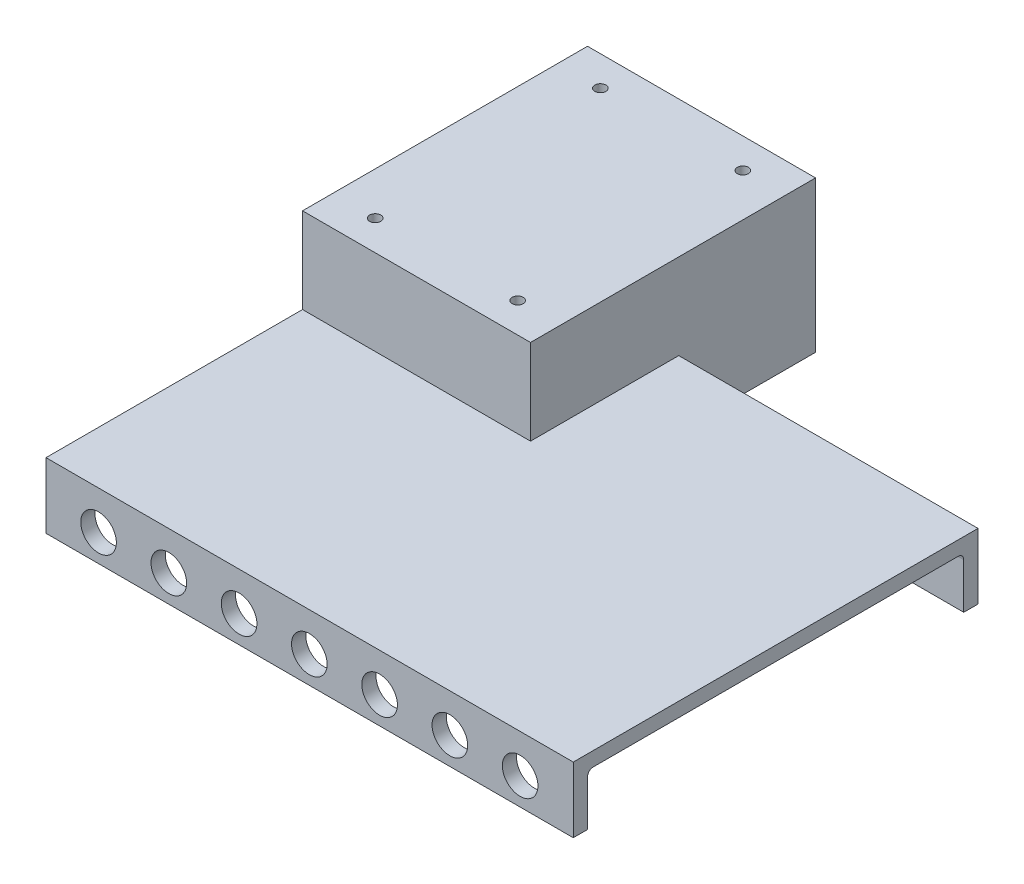
ISO-10303-21;
HEADER;
FILE_DESCRIPTION(('STEP AP214'),'2;1');
FILE_NAME('part.step','',(''),(''),'','','');
FILE_SCHEMA(('AUTOMOTIVE_DESIGN { 1 0 10303 214 1 1 1 1 }'));
ENDSEC;
DATA;
#1=APPLICATION_CONTEXT('core data for automotive mechanical design processes');
#2=APPLICATION_PROTOCOL_DEFINITION('international standard','automotive_design',2000,#1);
#3=PRODUCT_CONTEXT('',#1,'mechanical');
#4=PRODUCT('Part','Part','',(#3));
#5=PRODUCT_RELATED_PRODUCT_CATEGORY('part','',(#4));
#6=PRODUCT_DEFINITION_FORMATION('','',#4);
#7=PRODUCT_DEFINITION_CONTEXT('part definition',#1,'design');
#8=PRODUCT_DEFINITION('design','',#6,#7);
#9=PRODUCT_DEFINITION_SHAPE('','',#8);
#10=(LENGTH_UNIT() NAMED_UNIT(*) SI_UNIT(.MILLI.,.METRE.));
#11=(NAMED_UNIT(*) PLANE_ANGLE_UNIT() SI_UNIT($,.RADIAN.));
#12=(NAMED_UNIT(*) SI_UNIT($,.STERADIAN.) SOLID_ANGLE_UNIT());
#13=UNCERTAINTY_MEASURE_WITH_UNIT(LENGTH_MEASURE(1.E-05),#10,'distance_accuracy_value','');
#14=(GEOMETRIC_REPRESENTATION_CONTEXT(3) GLOBAL_UNCERTAINTY_ASSIGNED_CONTEXT((#13)) GLOBAL_UNIT_ASSIGNED_CONTEXT((#10,
#11,#12)) REPRESENTATION_CONTEXT('',''));
#15=CARTESIAN_POINT('',(0.,0.,0.));
#16=DIRECTION('',(0.,0.,1.));
#17=DIRECTION('',(1.,0.,0.));
#18=AXIS2_PLACEMENT_3D('',#15,#16,#17);
#19=CARTESIAN_POINT('',(0.,23.,0.));
#20=DIRECTION('',(1.,0.,0.));
#21=DIRECTION('',(0.,0.,-1.));
#22=AXIS2_PLACEMENT_3D('',#19,#20,#21);
#23=PLANE('',#22);
#24=DIRECTION('',(0.,-1.,0.));
#25=VECTOR('',#24,1.);
#26=CARTESIAN_POINT('',(0.,23.,-185.));
#27=LINE('',#26,#25);
#28=CARTESIAN_POINT('',(0.,46.,-185.));
#29=VERTEX_POINT('',#28);
#30=CARTESIAN_POINT('',(0.,0.,-185.));
#31=VERTEX_POINT('',#30);
#32=EDGE_CURVE('E217',#29,#31,#27,.T.);
#33=ORIENTED_EDGE('',*,*,#32,.F.);
#34=CARTESIAN_POINT('',(0.,46.,-183.));
#35=DIRECTION('',(1.,0.,0.));
#36=DIRECTION('',(0.,0.,-1.));
#37=AXIS2_PLACEMENT_3D('',#34,#35,#36);
#38=CIRCLE('',#37,2.);
#39=CARTESIAN_POINT('',(0.,48.,-183.));
#40=VERTEX_POINT('',#39);
#41=EDGE_CURVE('E348',#29,#40,#38,.T.);
#42=ORIENTED_EDGE('',*,*,#41,.T.);
#43=DIRECTION('',(0.,0.,1.));
#44=VECTOR('',#43,1.);
#45=CARTESIAN_POINT('',(0.,48.,0.));
#46=LINE('',#45,#44);
#47=CARTESIAN_POINT('',(0.,48.,-97.));
#48=VERTEX_POINT('',#47);
#49=EDGE_CURVE('E229',#40,#48,#46,.T.);
#50=ORIENTED_EDGE('',*,*,#49,.T.);
#51=CARTESIAN_POINT('',(0.,46.,-97.));
#52=DIRECTION('',(1.,0.,0.));
#53=DIRECTION('',(0.,0.,-1.));
#54=AXIS2_PLACEMENT_3D('',#51,#52,#53);
#55=CIRCLE('',#54,2.);
#56=CARTESIAN_POINT('',(0.,46.,-95.));
#57=VERTEX_POINT('',#56);
#58=EDGE_CURVE('E346',#48,#57,#55,.T.);
#59=ORIENTED_EDGE('',*,*,#58,.T.);
#60=DIRECTION('',(0.,-1.,0.));
#61=VECTOR('',#60,1.);
#62=CARTESIAN_POINT('',(0.,53.,-95.));
#63=LINE('',#62,#61);
#64=CARTESIAN_POINT('',(0.,18.,-95.));
#65=VERTEX_POINT('',#64);
#66=EDGE_CURVE('E196',#57,#65,#63,.T.);
#67=ORIENTED_EDGE('',*,*,#66,.T.);
#68=DIRECTION('',(0.,0.,1.));
#69=VECTOR('',#68,1.);
#70=CARTESIAN_POINT('',(0.,18.,0.));
#71=LINE('',#70,#69);
#72=CARTESIAN_POINT('',(0.,18.,-7.));
#73=VERTEX_POINT('',#72);
#74=EDGE_CURVE('E207',#65,#73,#71,.T.);
#75=ORIENTED_EDGE('',*,*,#74,.T.);
#76=CARTESIAN_POINT('',(0.,16.,-7.));
#77=DIRECTION('',(1.,0.,0.));
#78=DIRECTION('',(0.,0.,-1.));
#79=AXIS2_PLACEMENT_3D('',#76,#77,#78);
#80=CIRCLE('',#79,2.);
#81=CARTESIAN_POINT('',(0.,16.,-5.));
#82=VERTEX_POINT('',#81);
#83=EDGE_CURVE('E352',#73,#82,#80,.T.);
#84=ORIENTED_EDGE('',*,*,#83,.T.);
#85=DIRECTION('',(0.,-1.,0.));
#86=VECTOR('',#85,1.);
#87=CARTESIAN_POINT('',(0.,23.,-5.));
#88=LINE('',#87,#86);
#89=CARTESIAN_POINT('',(0.,0.,-5.));
#90=VERTEX_POINT('',#89);
#91=EDGE_CURVE('E223',#82,#90,#88,.T.);
#92=ORIENTED_EDGE('',*,*,#91,.T.);
#93=DIRECTION('',(0.,0.,1.));
#94=VECTOR('',#93,1.);
#95=CARTESIAN_POINT('',(0.,0.,0.));
#96=LINE('',#95,#94);
#97=CARTESIAN_POINT('',(0.,0.,0.));
#98=VERTEX_POINT('',#97);
#99=EDGE_CURVE('E276',#90,#98,#96,.T.);
#100=ORIENTED_EDGE('',*,*,#99,.T.);
#101=DIRECTION('',(0.,-1.,0.));
#102=VECTOR('',#101,1.);
#103=CARTESIAN_POINT('',(0.,23.,0.));
#104=LINE('',#103,#102);
#105=CARTESIAN_POINT('',(0.,23.,0.));
#106=VERTEX_POINT('',#105);
#107=EDGE_CURVE('E302',#106,#98,#104,.T.);
#108=ORIENTED_EDGE('',*,*,#107,.F.);
#109=DIRECTION('',(0.,0.,1.));
#110=VECTOR('',#109,1.);
#111=CARTESIAN_POINT('',(0.,23.,0.));
#112=LINE('',#111,#110);
#113=CARTESIAN_POINT('',(0.,23.,-90.));
#114=VERTEX_POINT('',#113);
#115=EDGE_CURVE('E277',#114,#106,#112,.T.);
#116=ORIENTED_EDGE('',*,*,#115,.F.);
#117=DIRECTION('',(0.,-1.,0.));
#118=VECTOR('',#117,1.);
#119=CARTESIAN_POINT('',(0.,53.,-90.));
#120=LINE('',#119,#118);
#121=CARTESIAN_POINT('',(0.,53.,-90.));
#122=VERTEX_POINT('',#121);
#123=EDGE_CURVE('E264',#122,#114,#120,.T.);
#124=ORIENTED_EDGE('',*,*,#123,.F.);
#125=DIRECTION('',(0.,0.,1.));
#126=VECTOR('',#125,1.);
#127=CARTESIAN_POINT('',(0.,53.,-90.));
#128=LINE('',#127,#126);
#129=CARTESIAN_POINT('',(0.,53.,-190.));
#130=VERTEX_POINT('',#129);
#131=EDGE_CURVE('E242',#130,#122,#128,.T.);
#132=ORIENTED_EDGE('',*,*,#131,.F.);
#133=DIRECTION('',(0.,-1.,0.));
#134=VECTOR('',#133,1.);
#135=CARTESIAN_POINT('',(0.,53.,-190.));
#136=LINE('',#135,#134);
#137=CARTESIAN_POINT('',(0.,0.,-190.));
#138=VERTEX_POINT('',#137);
#139=EDGE_CURVE('E252',#130,#138,#136,.T.);
#140=ORIENTED_EDGE('',*,*,#139,.T.);
#141=EDGE_CURVE('E287',#138,#31,#96,.T.);
#142=ORIENTED_EDGE('',*,*,#141,.T.);
#143=EDGE_LOOP('',(#33,#42,#50,#59,#67,#75,#84,#92,#100,#108,#116,#124,#132,#140,#142));
#144=FACE_BOUND('',#143,.T.);
#145=ADVANCED_FACE('F45',(#144),#23,.F.);
#146=CARTESIAN_POINT('',(0.,0.,0.));
#147=DIRECTION('',(0.,-1.,0.));
#148=DIRECTION('',(0.,0.,-1.));
#149=AXIS2_PLACEMENT_3D('',#146,#147,#148);
#150=PLANE('',#149);
#151=ORIENTED_EDGE('',*,*,#99,.F.);
#152=DIRECTION('',(1.,0.,0.));
#153=VECTOR('',#152,1.);
#154=CARTESIAN_POINT('',(0.,0.,-5.));
#155=LINE('',#154,#153);
#156=CARTESIAN_POINT('',(185.,0.,-5.));
#157=VERTEX_POINT('',#156);
#158=EDGE_CURVE('E208',#90,#157,#155,.T.);
#159=ORIENTED_EDGE('',*,*,#158,.T.);
#160=DIRECTION('',(0.,0.,-1.));
#161=VECTOR('',#160,1.);
#162=CARTESIAN_POINT('',(185.,0.,0.));
#163=LINE('',#162,#161);
#164=CARTESIAN_POINT('',(185.,0.,0.));
#165=VERTEX_POINT('',#164);
#166=EDGE_CURVE('E293',#165,#157,#163,.T.);
#167=ORIENTED_EDGE('',*,*,#166,.F.);
#168=DIRECTION('',(1.,0.,0.));
#169=VECTOR('',#168,1.);
#170=CARTESIAN_POINT('',(0.,0.,0.));
#171=LINE('',#170,#169);
#172=EDGE_CURVE('E290',#98,#165,#171,.T.);
#173=ORIENTED_EDGE('',*,*,#172,.F.);
#174=EDGE_LOOP('',(#151,#159,#167,#173));
#175=FACE_BOUND('',#174,.T.);
#176=ADVANCED_FACE('F440',(#175),#150,.T.);
#177=DIRECTION('',(0.,0.,-1.));
#178=VECTOR('',#177,1.);
#179=CARTESIAN_POINT('',(75.,0.,0.));
#180=LINE('',#179,#178);
#181=CARTESIAN_POINT('',(75.,0.,-137.));
#182=VERTEX_POINT('',#181);
#183=CARTESIAN_POINT('',(75.,0.,-185.));
#184=VERTEX_POINT('',#183);
#185=EDGE_CURVE('E236',#182,#184,#180,.T.);
#186=ORIENTED_EDGE('',*,*,#185,.T.);
#187=DIRECTION('',(-1.,0.,0.));
#188=VECTOR('',#187,1.);
#189=CARTESIAN_POINT('',(0.,0.,-185.));
#190=LINE('',#189,#188);
#191=EDGE_CURVE('E232',#184,#31,#190,.T.);
#192=ORIENTED_EDGE('',*,*,#191,.T.);
#193=ORIENTED_EDGE('',*,*,#141,.F.);
#194=DIRECTION('',(-1.,0.,0.));
#195=VECTOR('',#194,1.);
#196=CARTESIAN_POINT('',(0.,0.,-190.));
#197=LINE('',#196,#195);
#198=CARTESIAN_POINT('',(80.,0.,-190.));
#199=VERTEX_POINT('',#198);
#200=EDGE_CURVE('E246',#199,#138,#197,.T.);
#201=ORIENTED_EDGE('',*,*,#200,.F.);
#202=DIRECTION('',(0.,0.,-1.));
#203=VECTOR('',#202,1.);
#204=CARTESIAN_POINT('',(80.,0.,-90.));
#205=LINE('',#204,#203);
#206=CARTESIAN_POINT('',(80.,0.,-142.));
#207=VERTEX_POINT('',#206);
#208=EDGE_CURVE('E226',#207,#199,#205,.T.);
#209=ORIENTED_EDGE('',*,*,#208,.F.);
#210=DIRECTION('',(-1.,0.,0.));
#211=VECTOR('',#210,1.);
#212=CARTESIAN_POINT('',(0.,0.,-142.));
#213=LINE('',#212,#211);
#214=CARTESIAN_POINT('',(185.,0.,-142.));
#215=VERTEX_POINT('',#214);
#216=EDGE_CURVE('E280',#215,#207,#213,.T.);
#217=ORIENTED_EDGE('',*,*,#216,.F.);
#218=CARTESIAN_POINT('',(185.,0.,-137.));
#219=VERTEX_POINT('',#218);
#220=EDGE_CURVE('E292',#219,#215,#163,.T.);
#221=ORIENTED_EDGE('',*,*,#220,.F.);
#222=DIRECTION('',(-1.,0.,0.));
#223=VECTOR('',#222,1.);
#224=CARTESIAN_POINT('',(0.,0.,-137.));
#225=LINE('',#224,#223);
#226=EDGE_CURVE('E211',#219,#182,#225,.T.);
#227=ORIENTED_EDGE('',*,*,#226,.T.);
#228=EDGE_LOOP('',(#186,#192,#193,#201,#209,#217,#221,#227));
#229=FACE_BOUND('',#228,.T.);
#230=ADVANCED_FACE('F406',(#229),#150,.T.);
#231=CARTESIAN_POINT('',(0.,23.,-142.));
#232=DIRECTION('',(0.,0.,1.));
#233=DIRECTION('',(1.,0.,0.));
#234=AXIS2_PLACEMENT_3D('',#231,#232,#233);
#235=PLANE('',#234);
#236=DIRECTION('',(0.,-1.,0.));
#237=VECTOR('',#236,1.);
#238=CARTESIAN_POINT('',(80.,23.,-142.));
#239=LINE('',#238,#237);
#240=CARTESIAN_POINT('',(80.,23.,-142.));
#241=VERTEX_POINT('',#240);
#242=EDGE_CURVE('E270',#241,#207,#239,.T.);
#243=ORIENTED_EDGE('',*,*,#242,.F.);
#244=DIRECTION('',(-1.,0.,0.));
#245=VECTOR('',#244,1.);
#246=CARTESIAN_POINT('',(0.,23.,-142.));
#247=LINE('',#246,#245);
#248=CARTESIAN_POINT('',(185.,23.,-142.));
#249=VERTEX_POINT('',#248);
#250=EDGE_CURVE('E284',#249,#241,#247,.T.);
#251=ORIENTED_EDGE('',*,*,#250,.F.);
#252=DIRECTION('',(0.,-1.,0.));
#253=VECTOR('',#252,1.);
#254=CARTESIAN_POINT('',(185.,23.,-142.));
#255=LINE('',#254,#253);
#256=EDGE_CURVE('E286',#249,#215,#255,.T.);
#257=ORIENTED_EDGE('',*,*,#256,.T.);
#258=ORIENTED_EDGE('',*,*,#216,.T.);
#259=EDGE_LOOP('',(#243,#251,#257,#258));
#260=FACE_BOUND('',#259,.T.);
#261=ADVANCED_FACE('F456',(#260),#235,.F.);
#262=CARTESIAN_POINT('',(0.,23.,0.));
#263=DIRECTION('',(0.,-1.,0.));
#264=DIRECTION('',(0.,0.,-1.));
#265=AXIS2_PLACEMENT_3D('',#262,#263,#264);
#266=PLANE('',#265);
#267=DIRECTION('',(1.,0.,0.));
#268=VECTOR('',#267,1.);
#269=CARTESIAN_POINT('',(0.,23.,-90.));
#270=LINE('',#269,#268);
#271=CARTESIAN_POINT('',(80.,23.,-90.));
#272=VERTEX_POINT('',#271);
#273=EDGE_CURVE('E273',#114,#272,#270,.T.);
#274=ORIENTED_EDGE('',*,*,#273,.F.);
#275=ORIENTED_EDGE('',*,*,#115,.T.);
#276=DIRECTION('',(1.,0.,0.));
#277=VECTOR('',#276,1.);
#278=CARTESIAN_POINT('',(0.,23.,0.));
#279=LINE('',#278,#277);
#280=CARTESIAN_POINT('',(185.,23.,0.));
#281=VERTEX_POINT('',#280);
#282=EDGE_CURVE('E279',#106,#281,#279,.T.);
#283=ORIENTED_EDGE('',*,*,#282,.T.);
#284=DIRECTION('',(0.,0.,-1.));
#285=VECTOR('',#284,1.);
#286=CARTESIAN_POINT('',(185.,23.,0.));
#287=LINE('',#286,#285);
#288=EDGE_CURVE('E282',#281,#249,#287,.T.);
#289=ORIENTED_EDGE('',*,*,#288,.T.);
#290=ORIENTED_EDGE('',*,*,#250,.T.);
#291=DIRECTION('',(0.,0.,-1.));
#292=VECTOR('',#291,1.);
#293=CARTESIAN_POINT('',(80.,23.,0.));
#294=LINE('',#293,#292);
#295=EDGE_CURVE('E267',#272,#241,#294,.T.);
#296=ORIENTED_EDGE('',*,*,#295,.F.);
#297=EDGE_LOOP('',(#274,#275,#283,#289,#290,#296));
#298=FACE_BOUND('',#297,.T.);
#299=ADVANCED_FACE('F451',(#298),#266,.F.);
#300=CARTESIAN_POINT('',(0.,23.,0.));
#301=DIRECTION('',(0.,0.,-1.));
#302=DIRECTION('',(-1.,0.,0.));
#303=AXIS2_PLACEMENT_3D('',#300,#301,#302);
#304=PLANE('',#303);
#305=CARTESIAN_POINT('',(166.345613164055,9.5,0.));
#306=DIRECTION('',(0.,0.,1.));
#307=DIRECTION('',(1.,0.,0.));
#308=AXIS2_PLACEMENT_3D('',#305,#306,#307);
#309=CIRCLE('',#308,6.25);
#310=CARTESIAN_POINT('',(172.595613164055,9.5,0.));
#311=VERTEX_POINT('',#310);
#312=EDGE_CURVE('E360',#311,#311,#309,.T.);
#313=ORIENTED_EDGE('',*,*,#312,.F.);
#314=EDGE_LOOP('',(#313));
#315=FACE_BOUND('',#314,.T.);
#316=CARTESIAN_POINT('',(141.694260970046,9.5,0.));
#317=DIRECTION('',(0.,0.,1.));
#318=DIRECTION('',(1.,0.,0.));
#319=AXIS2_PLACEMENT_3D('',#316,#317,#318);
#320=CIRCLE('',#319,6.25);
#321=CARTESIAN_POINT('',(147.944260970046,9.5,0.));
#322=VERTEX_POINT('',#321);
#323=EDGE_CURVE('E553',#322,#322,#320,.T.);
#324=ORIENTED_EDGE('',*,*,#323,.F.);
#325=EDGE_LOOP('',(#324));
#326=FACE_BOUND('',#325,.T.);
#327=CARTESIAN_POINT('',(67.7402043880185,9.5,0.));
#328=DIRECTION('',(0.,0.,1.));
#329=DIRECTION('',(1.,0.,0.));
#330=AXIS2_PLACEMENT_3D('',#327,#328,#329);
#331=CIRCLE('',#330,6.25);
#332=CARTESIAN_POINT('',(73.9902043880185,9.5,0.));
#333=VERTEX_POINT('',#332);
#334=EDGE_CURVE('E554',#333,#333,#331,.T.);
#335=ORIENTED_EDGE('',*,*,#334,.F.);
#336=EDGE_LOOP('',(#335));
#337=FACE_BOUND('',#336,.T.);
#338=CARTESIAN_POINT('',(92.3915565820277,9.5,0.));
#339=DIRECTION('',(0.,0.,1.));
#340=DIRECTION('',(1.,0.,0.));
#341=AXIS2_PLACEMENT_3D('',#338,#339,#340);
#342=CIRCLE('',#341,6.25);
#343=CARTESIAN_POINT('',(98.6415565820277,9.5,0.));
#344=VERTEX_POINT('',#343);
#345=EDGE_CURVE('E549',#344,#344,#342,.T.);
#346=ORIENTED_EDGE('',*,*,#345,.F.);
#347=EDGE_LOOP('',(#346));
#348=FACE_BOUND('',#347,.T.);
#349=CARTESIAN_POINT('',(117.042908776037,9.5,0.));
#350=DIRECTION('',(0.,0.,1.));
#351=DIRECTION('',(1.,0.,0.));
#352=AXIS2_PLACEMENT_3D('',#349,#350,#351);
#353=CIRCLE('',#352,6.25);
#354=CARTESIAN_POINT('',(123.292908776037,9.5,0.));
#355=VERTEX_POINT('',#354);
#356=EDGE_CURVE('E546',#355,#355,#353,.T.);
#357=ORIENTED_EDGE('',*,*,#356,.F.);
#358=EDGE_LOOP('',(#357));
#359=FACE_BOUND('',#358,.T.);
#360=CARTESIAN_POINT('',(18.4375,9.5,0.));
#361=DIRECTION('',(0.,0.,1.));
#362=DIRECTION('',(1.,0.,0.));
#363=AXIS2_PLACEMENT_3D('',#360,#361,#362);
#364=CIRCLE('',#363,6.25);
#365=CARTESIAN_POINT('',(24.6875,9.5,0.));
#366=VERTEX_POINT('',#365);
#367=EDGE_CURVE('E550',#366,#366,#364,.T.);
#368=ORIENTED_EDGE('',*,*,#367,.F.);
#369=EDGE_LOOP('',(#368));
#370=FACE_BOUND('',#369,.T.);
#371=CARTESIAN_POINT('',(43.0888521940092,9.5,0.));
#372=DIRECTION('',(0.,0.,1.));
#373=DIRECTION('',(1.,0.,0.));
#374=AXIS2_PLACEMENT_3D('',#371,#372,#373);
#375=CIRCLE('',#374,6.25000000000001);
#376=CARTESIAN_POINT('',(49.3388521940092,9.5,0.));
#377=VERTEX_POINT('',#376);
#378=EDGE_CURVE('E310',#377,#377,#375,.T.);
#379=ORIENTED_EDGE('',*,*,#378,.F.);
#380=EDGE_LOOP('',(#379));
#381=FACE_BOUND('',#380,.T.);
#382=ORIENTED_EDGE('',*,*,#172,.T.);
#383=DIRECTION('',(0.,-1.,0.));
#384=VECTOR('',#383,1.);
#385=CARTESIAN_POINT('',(185.,23.,0.));
#386=LINE('',#385,#384);
#387=EDGE_CURVE('E299',#281,#165,#386,.T.);
#388=ORIENTED_EDGE('',*,*,#387,.F.);
#389=ORIENTED_EDGE('',*,*,#282,.F.);
#390=ORIENTED_EDGE('',*,*,#107,.T.);
#391=EDGE_LOOP('',(#382,#388,#389,#390));
#392=FACE_BOUND('',#391,.T.);
#393=ADVANCED_FACE('F448',(#315,#326,#337,#348,#359,#370,#381,#392),#304,.F.);
#394=CARTESIAN_POINT('',(185.,23.,0.));
#395=DIRECTION('',(-1.,0.,0.));
#396=DIRECTION('',(0.,0.,1.));
#397=AXIS2_PLACEMENT_3D('',#394,#395,#396);
#398=PLANE('',#397);
#399=DIRECTION('',(0.,-1.,0.));
#400=VECTOR('',#399,1.);
#401=CARTESIAN_POINT('',(185.,23.,-5.));
#402=LINE('',#401,#400);
#403=CARTESIAN_POINT('',(185.,16.,-5.));
#404=VERTEX_POINT('',#403);
#405=EDGE_CURVE('E220',#404,#157,#402,.T.);
#406=ORIENTED_EDGE('',*,*,#405,.F.);
#407=CARTESIAN_POINT('',(185.,16.,-7.));
#408=DIRECTION('',(-1.,0.,0.));
#409=DIRECTION('',(0.,0.,1.));
#410=AXIS2_PLACEMENT_3D('',#407,#408,#409);
#411=CIRCLE('',#410,2.);
#412=CARTESIAN_POINT('',(185.,18.,-7.));
#413=VERTEX_POINT('',#412);
#414=EDGE_CURVE('E350',#404,#413,#411,.T.);
#415=ORIENTED_EDGE('',*,*,#414,.T.);
#416=DIRECTION('',(0.,0.,-1.));
#417=VECTOR('',#416,1.);
#418=CARTESIAN_POINT('',(185.,18.,0.));
#419=LINE('',#418,#417);
#420=CARTESIAN_POINT('',(185.,18.,-135.));
#421=VERTEX_POINT('',#420);
#422=EDGE_CURVE('E221',#413,#421,#419,.T.);
#423=ORIENTED_EDGE('',*,*,#422,.T.);
#424=CARTESIAN_POINT('',(185.,16.,-135.));
#425=DIRECTION('',(-1.,0.,0.));
#426=DIRECTION('',(0.,0.,1.));
#427=AXIS2_PLACEMENT_3D('',#424,#425,#426);
#428=CIRCLE('',#427,2.);
#429=CARTESIAN_POINT('',(185.,16.,-137.));
#430=VERTEX_POINT('',#429);
#431=EDGE_CURVE('E11',#421,#430,#428,.T.);
#432=ORIENTED_EDGE('',*,*,#431,.T.);
#433=DIRECTION('',(0.,-1.,0.));
#434=VECTOR('',#433,1.);
#435=CARTESIAN_POINT('',(185.,23.,-137.));
#436=LINE('',#435,#434);
#437=EDGE_CURVE('E218',#430,#219,#436,.T.);
#438=ORIENTED_EDGE('',*,*,#437,.T.);
#439=ORIENTED_EDGE('',*,*,#220,.T.);
#440=ORIENTED_EDGE('',*,*,#256,.F.);
#441=ORIENTED_EDGE('',*,*,#288,.F.);
#442=ORIENTED_EDGE('',*,*,#387,.T.);
#443=ORIENTED_EDGE('',*,*,#166,.T.);
#444=EDGE_LOOP('',(#406,#415,#423,#432,#438,#439,#440,#441,#442,#443));
#445=FACE_BOUND('',#444,.T.);
#446=ADVANCED_FACE('F414',(#445),#398,.F.);
#447=CARTESIAN_POINT('',(0.,53.,-90.));
#448=DIRECTION('',(0.,0.,-1.));
#449=DIRECTION('',(-1.,0.,0.));
#450=AXIS2_PLACEMENT_3D('',#447,#448,#449);
#451=PLANE('',#450);
#452=ORIENTED_EDGE('',*,*,#123,.T.);
#453=ORIENTED_EDGE('',*,*,#273,.T.);
#454=DIRECTION('',(0.,-1.,0.));
#455=VECTOR('',#454,1.);
#456=CARTESIAN_POINT('',(80.,53.,-90.));
#457=LINE('',#456,#455);
#458=CARTESIAN_POINT('',(80.,53.,-90.));
#459=VERTEX_POINT('',#458);
#460=EDGE_CURVE('E261',#459,#272,#457,.T.);
#461=ORIENTED_EDGE('',*,*,#460,.F.);
#462=DIRECTION('',(1.,0.,0.));
#463=VECTOR('',#462,1.);
#464=CARTESIAN_POINT('',(0.,53.,-90.));
#465=LINE('',#464,#463);
#466=EDGE_CURVE('E245',#122,#459,#465,.T.);
#467=ORIENTED_EDGE('',*,*,#466,.F.);
#468=EDGE_LOOP('',(#452,#453,#461,#467));
#469=FACE_BOUND('',#468,.T.);
#470=ADVANCED_FACE('F455',(#469),#451,.F.);
#471=CARTESIAN_POINT('',(80.,53.,-90.));
#472=DIRECTION('',(-1.,0.,0.));
#473=DIRECTION('',(0.,0.,1.));
#474=AXIS2_PLACEMENT_3D('',#471,#472,#473);
#475=PLANE('',#474);
#476=ORIENTED_EDGE('',*,*,#295,.T.);
#477=ORIENTED_EDGE('',*,*,#242,.T.);
#478=ORIENTED_EDGE('',*,*,#208,.T.);
#479=DIRECTION('',(0.,-1.,0.));
#480=VECTOR('',#479,1.);
#481=CARTESIAN_POINT('',(80.,53.,-190.));
#482=LINE('',#481,#480);
#483=CARTESIAN_POINT('',(80.,53.,-190.));
#484=VERTEX_POINT('',#483);
#485=EDGE_CURVE('E258',#484,#199,#482,.T.);
#486=ORIENTED_EDGE('',*,*,#485,.F.);
#487=DIRECTION('',(0.,0.,-1.));
#488=VECTOR('',#487,1.);
#489=CARTESIAN_POINT('',(80.,53.,-90.));
#490=LINE('',#489,#488);
#491=EDGE_CURVE('E248',#459,#484,#490,.T.);
#492=ORIENTED_EDGE('',*,*,#491,.F.);
#493=ORIENTED_EDGE('',*,*,#460,.T.);
#494=EDGE_LOOP('',(#476,#477,#478,#486,#492,#493));
#495=FACE_BOUND('',#494,.T.);
#496=ADVANCED_FACE('F465',(#495),#475,.F.);
#497=CARTESIAN_POINT('',(0.,53.,-190.));
#498=DIRECTION('',(0.,0.,1.));
#499=DIRECTION('',(1.,0.,0.));
#500=AXIS2_PLACEMENT_3D('',#497,#498,#499);
#501=PLANE('',#500);
#502=ORIENTED_EDGE('',*,*,#200,.T.);
#503=ORIENTED_EDGE('',*,*,#139,.F.);
#504=DIRECTION('',(-1.,0.,0.));
#505=VECTOR('',#504,1.);
#506=CARTESIAN_POINT('',(0.,53.,-190.));
#507=LINE('',#506,#505);
#508=EDGE_CURVE('E250',#484,#130,#507,.T.);
#509=ORIENTED_EDGE('',*,*,#508,.F.);
#510=ORIENTED_EDGE('',*,*,#485,.T.);
#511=EDGE_LOOP('',(#502,#503,#509,#510));
#512=FACE_BOUND('',#511,.T.);
#513=ADVANCED_FACE('F469',(#512),#501,.F.);
#514=CARTESIAN_POINT('',(0.,53.,0.));
#515=DIRECTION('',(0.,-1.,0.));
#516=DIRECTION('',(0.,0.,-1.));
#517=AXIS2_PLACEMENT_3D('',#514,#515,#516);
#518=PLANE('',#517);
#519=CARTESIAN_POINT('',(65.,53.,-100.5));
#520=DIRECTION('',(0.,1.,0.));
#521=DIRECTION('',(0.,0.,1.));
#522=AXIS2_PLACEMENT_3D('',#519,#520,#521);
#523=CIRCLE('',#522,1.95);
#524=CARTESIAN_POINT('',(65.,53.,-98.55));
#525=VERTEX_POINT('',#524);
#526=EDGE_CURVE('E541',#525,#525,#523,.T.);
#527=ORIENTED_EDGE('',*,*,#526,.F.);
#528=EDGE_LOOP('',(#527));
#529=FACE_BOUND('',#528,.T.);
#530=CARTESIAN_POINT('',(65.,53.,-179.5));
#531=DIRECTION('',(0.,1.,0.));
#532=DIRECTION('',(0.,0.,1.));
#533=AXIS2_PLACEMENT_3D('',#530,#531,#532);
#534=CIRCLE('',#533,1.95000000000003);
#535=CARTESIAN_POINT('',(65.,53.,-177.55));
#536=VERTEX_POINT('',#535);
#537=EDGE_CURVE('E536',#536,#536,#534,.T.);
#538=ORIENTED_EDGE('',*,*,#537,.F.);
#539=EDGE_LOOP('',(#538));
#540=FACE_BOUND('',#539,.T.);
#541=CARTESIAN_POINT('',(15.,53.,-179.5));
#542=DIRECTION('',(0.,1.,0.));
#543=DIRECTION('',(0.,0.,1.));
#544=AXIS2_PLACEMENT_3D('',#541,#542,#543);
#545=CIRCLE('',#544,1.95);
#546=CARTESIAN_POINT('',(15.,53.,-177.55));
#547=VERTEX_POINT('',#546);
#548=EDGE_CURVE('E534',#547,#547,#545,.T.);
#549=ORIENTED_EDGE('',*,*,#548,.F.);
#550=EDGE_LOOP('',(#549));
#551=FACE_BOUND('',#550,.T.);
#552=CARTESIAN_POINT('',(15.,53.,-100.5));
#553=DIRECTION('',(0.,1.,0.));
#554=DIRECTION('',(0.,0.,1.));
#555=AXIS2_PLACEMENT_3D('',#552,#553,#554);
#556=CIRCLE('',#555,1.94999999999999);
#557=CARTESIAN_POINT('',(15.,53.,-98.55));
#558=VERTEX_POINT('',#557);
#559=EDGE_CURVE('E365',#558,#558,#556,.T.);
#560=ORIENTED_EDGE('',*,*,#559,.F.);
#561=EDGE_LOOP('',(#560));
#562=FACE_BOUND('',#561,.T.);
#563=ORIENTED_EDGE('',*,*,#131,.T.);
#564=ORIENTED_EDGE('',*,*,#466,.T.);
#565=ORIENTED_EDGE('',*,*,#491,.T.);
#566=ORIENTED_EDGE('',*,*,#508,.T.);
#567=EDGE_LOOP('',(#563,#564,#565,#566));
#568=FACE_BOUND('',#567,.T.);
#569=ADVANCED_FACE('F473',(#529,#540,#551,#562,#568),#518,.F.);
#570=CARTESIAN_POINT('',(0.,23.,-137.));
#571=DIRECTION('',(0.,0.,1.));
#572=DIRECTION('',(1.,0.,0.));
#573=AXIS2_PLACEMENT_3D('',#570,#571,#572);
#574=PLANE('',#573);
#575=ORIENTED_EDGE('',*,*,#437,.F.);
#576=DIRECTION('',(-1.,0.,0.));
#577=VECTOR('',#576,1.);
#578=CARTESIAN_POINT('',(75.,16.,-137.));
#579=LINE('',#578,#577);
#580=CARTESIAN_POINT('',(75.,16.,-137.));
#581=VERTEX_POINT('',#580);
#582=EDGE_CURVE('E343',#430,#581,#579,.T.);
#583=ORIENTED_EDGE('',*,*,#582,.T.);
#584=DIRECTION('',(0.,-1.,0.));
#585=VECTOR('',#584,1.);
#586=CARTESIAN_POINT('',(75.,23.,-137.));
#587=LINE('',#586,#585);
#588=EDGE_CURVE('E204',#581,#182,#587,.T.);
#589=ORIENTED_EDGE('',*,*,#588,.T.);
#590=ORIENTED_EDGE('',*,*,#226,.F.);
#591=EDGE_LOOP('',(#575,#583,#589,#590));
#592=FACE_BOUND('',#591,.T.);
#593=ADVANCED_FACE('F410',(#592),#574,.T.);
#594=CARTESIAN_POINT('',(0.,18.,0.));
#595=DIRECTION('',(0.,-1.,0.));
#596=DIRECTION('',(0.,0.,-1.));
#597=AXIS2_PLACEMENT_3D('',#594,#595,#596);
#598=PLANE('',#597);
#599=ORIENTED_EDGE('',*,*,#422,.F.);
#600=DIRECTION('',(1.,0.,0.));
#601=VECTOR('',#600,1.);
#602=CARTESIAN_POINT('',(0.,18.,-7.));
#603=LINE('',#602,#601);
#604=EDGE_CURVE('E68',#413,#73,#603,.F.);
#605=ORIENTED_EDGE('',*,*,#604,.T.);
#606=ORIENTED_EDGE('',*,*,#74,.F.);
#607=DIRECTION('',(1.,0.,0.));
#608=VECTOR('',#607,1.);
#609=CARTESIAN_POINT('',(0.,18.,-95.));
#610=LINE('',#609,#608);
#611=CARTESIAN_POINT('',(75.,18.,-95.));
#612=VERTEX_POINT('',#611);
#613=EDGE_CURVE('E190',#65,#612,#610,.T.);
#614=ORIENTED_EDGE('',*,*,#613,.T.);
#615=DIRECTION('',(0.,0.,-1.));
#616=VECTOR('',#615,1.);
#617=CARTESIAN_POINT('',(75.,18.,0.));
#618=LINE('',#617,#616);
#619=CARTESIAN_POINT('',(75.,18.,-135.));
#620=VERTEX_POINT('',#619);
#621=EDGE_CURVE('E200',#612,#620,#618,.T.);
#622=ORIENTED_EDGE('',*,*,#621,.T.);
#623=DIRECTION('',(-1.,0.,0.));
#624=VECTOR('',#623,1.);
#625=CARTESIAN_POINT('',(185.,18.,-135.));
#626=LINE('',#625,#624);
#627=EDGE_CURVE('E340',#620,#421,#626,.F.);
#628=ORIENTED_EDGE('',*,*,#627,.T.);
#629=EDGE_LOOP('',(#599,#605,#606,#614,#622,#628));
#630=FACE_BOUND('',#629,.T.);
#631=ADVANCED_FACE('F206',(#630),#598,.T.);
#632=CARTESIAN_POINT('',(0.,23.,-5.));
#633=DIRECTION('',(0.,0.,-1.));
#634=DIRECTION('',(-1.,0.,0.));
#635=AXIS2_PLACEMENT_3D('',#632,#633,#634);
#636=PLANE('',#635);
#637=CARTESIAN_POINT('',(166.345613164055,9.5,-5.));
#638=DIRECTION('',(0.,0.,-1.));
#639=DIRECTION('',(-1.,0.,0.));
#640=AXIS2_PLACEMENT_3D('',#637,#638,#639);
#641=CIRCLE('',#640,6.25);
#642=CARTESIAN_POINT('',(160.095613164055,9.5,-5.));
#643=VERTEX_POINT('',#642);
#644=EDGE_CURVE('E239',#643,#643,#641,.T.);
#645=ORIENTED_EDGE('',*,*,#644,.F.);
#646=EDGE_LOOP('',(#645));
#647=FACE_BOUND('',#646,.T.);
#648=CARTESIAN_POINT('',(141.694260970046,9.5,-5.));
#649=DIRECTION('',(0.,0.,-1.));
#650=DIRECTION('',(-1.,0.,0.));
#651=AXIS2_PLACEMENT_3D('',#648,#649,#650);
#652=CIRCLE('',#651,6.25);
#653=CARTESIAN_POINT('',(135.444260970046,9.5,-5.));
#654=VERTEX_POINT('',#653);
#655=EDGE_CURVE('E322',#654,#654,#652,.T.);
#656=ORIENTED_EDGE('',*,*,#655,.F.);
#657=EDGE_LOOP('',(#656));
#658=FACE_BOUND('',#657,.T.);
#659=CARTESIAN_POINT('',(67.7402043880185,9.5,-5.));
#660=DIRECTION('',(0.,0.,-1.));
#661=DIRECTION('',(-1.,0.,0.));
#662=AXIS2_PLACEMENT_3D('',#659,#660,#661);
#663=CIRCLE('',#662,6.25);
#664=CARTESIAN_POINT('',(61.4902043880185,9.5,-5.));
#665=VERTEX_POINT('',#664);
#666=EDGE_CURVE('E319',#665,#665,#663,.T.);
#667=ORIENTED_EDGE('',*,*,#666,.F.);
#668=EDGE_LOOP('',(#667));
#669=FACE_BOUND('',#668,.T.);
#670=CARTESIAN_POINT('',(92.3915565820277,9.5,-5.));
#671=DIRECTION('',(0.,0.,-1.));
#672=DIRECTION('',(-1.,0.,0.));
#673=AXIS2_PLACEMENT_3D('',#670,#671,#672);
#674=CIRCLE('',#673,6.25);
#675=CARTESIAN_POINT('',(86.1415565820277,9.5,-5.));
#676=VERTEX_POINT('',#675);
#677=EDGE_CURVE('E316',#676,#676,#674,.T.);
#678=ORIENTED_EDGE('',*,*,#677,.F.);
#679=EDGE_LOOP('',(#678));
#680=FACE_BOUND('',#679,.T.);
#681=CARTESIAN_POINT('',(117.042908776037,9.5,-5.));
#682=DIRECTION('',(0.,0.,-1.));
#683=DIRECTION('',(-1.,0.,0.));
#684=AXIS2_PLACEMENT_3D('',#681,#682,#683);
#685=CIRCLE('',#684,6.25);
#686=CARTESIAN_POINT('',(110.792908776037,9.5,-5.));
#687=VERTEX_POINT('',#686);
#688=EDGE_CURVE('E313',#687,#687,#685,.T.);
#689=ORIENTED_EDGE('',*,*,#688,.F.);
#690=EDGE_LOOP('',(#689));
#691=FACE_BOUND('',#690,.T.);
#692=CARTESIAN_POINT('',(18.4375,9.5,-5.));
#693=DIRECTION('',(0.,0.,-1.));
#694=DIRECTION('',(-1.,0.,0.));
#695=AXIS2_PLACEMENT_3D('',#692,#693,#694);
#696=CIRCLE('',#695,6.25);
#697=CARTESIAN_POINT('',(12.1875,9.5,-5.));
#698=VERTEX_POINT('',#697);
#699=EDGE_CURVE('E309',#698,#698,#696,.T.);
#700=ORIENTED_EDGE('',*,*,#699,.F.);
#701=EDGE_LOOP('',(#700));
#702=FACE_BOUND('',#701,.T.);
#703=CARTESIAN_POINT('',(43.0888521940092,9.5,-5.));
#704=DIRECTION('',(0.,0.,-1.));
#705=DIRECTION('',(-1.,0.,0.));
#706=AXIS2_PLACEMENT_3D('',#703,#704,#705);
#707=CIRCLE('',#706,6.25000000000001);
#708=CARTESIAN_POINT('',(36.8388521940092,9.5,-5.));
#709=VERTEX_POINT('',#708);
#710=EDGE_CURVE('E306',#709,#709,#707,.T.);
#711=ORIENTED_EDGE('',*,*,#710,.F.);
#712=EDGE_LOOP('',(#711));
#713=FACE_BOUND('',#712,.T.);
#714=ORIENTED_EDGE('',*,*,#91,.F.);
#715=DIRECTION('',(1.,0.,0.));
#716=VECTOR('',#715,1.);
#717=CARTESIAN_POINT('',(185.,16.,-5.));
#718=LINE('',#717,#716);
#719=EDGE_CURVE('E337',#82,#404,#718,.T.);
#720=ORIENTED_EDGE('',*,*,#719,.T.);
#721=ORIENTED_EDGE('',*,*,#405,.T.);
#722=ORIENTED_EDGE('',*,*,#158,.F.);
#723=EDGE_LOOP('',(#714,#720,#721,#722));
#724=FACE_BOUND('',#723,.T.);
#725=ADVANCED_FACE('F421',(#647,#658,#669,#680,#691,#702,#713,#724),#636,.T.);
#726=CARTESIAN_POINT('',(0.,53.,-95.));
#727=DIRECTION('',(0.,0.,-1.));
#728=DIRECTION('',(-1.,0.,0.));
#729=AXIS2_PLACEMENT_3D('',#726,#727,#728);
#730=PLANE('',#729);
#731=ORIENTED_EDGE('',*,*,#66,.F.);
#732=DIRECTION('',(1.,0.,0.));
#733=VECTOR('',#732,1.);
#734=CARTESIAN_POINT('',(75.,46.,-95.));
#735=LINE('',#734,#733);
#736=CARTESIAN_POINT('',(75.,46.,-95.));
#737=VERTEX_POINT('',#736);
#738=EDGE_CURVE('E192',#57,#737,#735,.T.);
#739=ORIENTED_EDGE('',*,*,#738,.T.);
#740=DIRECTION('',(0.,-1.,0.));
#741=VECTOR('',#740,1.);
#742=CARTESIAN_POINT('',(75.,53.,-95.));
#743=LINE('',#742,#741);
#744=EDGE_CURVE('E185',#737,#612,#743,.T.);
#745=ORIENTED_EDGE('',*,*,#744,.T.);
#746=ORIENTED_EDGE('',*,*,#613,.F.);
#747=EDGE_LOOP('',(#731,#739,#745,#746));
#748=FACE_BOUND('',#747,.T.);
#749=ADVANCED_FACE('F188',(#748),#730,.T.);
#750=CARTESIAN_POINT('',(75.,53.,-90.));
#751=DIRECTION('',(-1.,0.,0.));
#752=DIRECTION('',(0.,0.,1.));
#753=AXIS2_PLACEMENT_3D('',#750,#751,#752);
#754=PLANE('',#753);
#755=ORIENTED_EDGE('',*,*,#744,.F.);
#756=DIRECTION('',(0.,0.,-1.));
#757=VECTOR('',#756,1.);
#758=CARTESIAN_POINT('',(75.,46.,-185.));
#759=LINE('',#758,#757);
#760=CARTESIAN_POINT('',(75.,46.,-185.));
#761=VERTEX_POINT('',#760);
#762=EDGE_CURVE('E305',#737,#761,#759,.T.);
#763=ORIENTED_EDGE('',*,*,#762,.T.);
#764=DIRECTION('',(0.,-1.,0.));
#765=VECTOR('',#764,1.);
#766=CARTESIAN_POINT('',(75.,53.,-185.));
#767=LINE('',#766,#765);
#768=EDGE_CURVE('E197',#761,#184,#767,.T.);
#769=ORIENTED_EDGE('',*,*,#768,.T.);
#770=ORIENTED_EDGE('',*,*,#185,.F.);
#771=ORIENTED_EDGE('',*,*,#588,.F.);
#772=CARTESIAN_POINT('',(75.,16.,-135.));
#773=DIRECTION('',(-1.,0.,0.));
#774=DIRECTION('',(0.,0.,1.));
#775=AXIS2_PLACEMENT_3D('',#772,#773,#774);
#776=CIRCLE('',#775,2.);
#777=EDGE_CURVE('E54',#581,#620,#776,.F.);
#778=ORIENTED_EDGE('',*,*,#777,.T.);
#779=ORIENTED_EDGE('',*,*,#621,.F.);
#780=EDGE_LOOP('',(#755,#763,#769,#770,#771,#778,#779));
#781=FACE_BOUND('',#780,.T.);
#782=ADVANCED_FACE('F201',(#781),#754,.T.);
#783=CARTESIAN_POINT('',(0.,53.,-185.));
#784=DIRECTION('',(0.,0.,1.));
#785=DIRECTION('',(1.,0.,0.));
#786=AXIS2_PLACEMENT_3D('',#783,#784,#785);
#787=PLANE('',#786);
#788=ORIENTED_EDGE('',*,*,#768,.F.);
#789=DIRECTION('',(-1.,0.,0.));
#790=VECTOR('',#789,1.);
#791=CARTESIAN_POINT('',(0.,46.,-185.));
#792=LINE('',#791,#790);
#793=EDGE_CURVE('E335',#761,#29,#792,.T.);
#794=ORIENTED_EDGE('',*,*,#793,.T.);
#795=ORIENTED_EDGE('',*,*,#32,.T.);
#796=ORIENTED_EDGE('',*,*,#191,.F.);
#797=EDGE_LOOP('',(#788,#794,#795,#796));
#798=FACE_BOUND('',#797,.T.);
#799=ADVANCED_FACE('F381',(#798),#787,.T.);
#800=CARTESIAN_POINT('',(0.,48.,0.));
#801=DIRECTION('',(0.,-1.,0.));
#802=DIRECTION('',(0.,0.,-1.));
#803=AXIS2_PLACEMENT_3D('',#800,#801,#802);
#804=PLANE('',#803);
#805=CARTESIAN_POINT('',(65.,48.,-100.5));
#806=DIRECTION('',(0.,-1.,0.));
#807=DIRECTION('',(0.,0.,-1.));
#808=AXIS2_PLACEMENT_3D('',#805,#806,#807);
#809=CIRCLE('',#808,1.95);
#810=CARTESIAN_POINT('',(65.,48.,-102.45));
#811=VERTEX_POINT('',#810);
#812=EDGE_CURVE('E49',#811,#811,#809,.T.);
#813=ORIENTED_EDGE('',*,*,#812,.F.);
#814=EDGE_LOOP('',(#813));
#815=FACE_BOUND('',#814,.T.);
#816=CARTESIAN_POINT('',(65.,48.,-179.5));
#817=DIRECTION('',(0.,-1.,0.));
#818=DIRECTION('',(0.,0.,-1.));
#819=AXIS2_PLACEMENT_3D('',#816,#817,#818);
#820=CIRCLE('',#819,1.95000000000003);
#821=CARTESIAN_POINT('',(65.,48.,-181.45));
#822=VERTEX_POINT('',#821);
#823=EDGE_CURVE('E367',#822,#822,#820,.T.);
#824=ORIENTED_EDGE('',*,*,#823,.F.);
#825=EDGE_LOOP('',(#824));
#826=FACE_BOUND('',#825,.T.);
#827=CARTESIAN_POINT('',(15.,48.,-179.5));
#828=DIRECTION('',(0.,-1.,0.));
#829=DIRECTION('',(0.,0.,-1.));
#830=AXIS2_PLACEMENT_3D('',#827,#828,#829);
#831=CIRCLE('',#830,1.95);
#832=CARTESIAN_POINT('',(15.,48.,-181.45));
#833=VERTEX_POINT('',#832);
#834=EDGE_CURVE('E364',#833,#833,#831,.T.);
#835=ORIENTED_EDGE('',*,*,#834,.F.);
#836=EDGE_LOOP('',(#835));
#837=FACE_BOUND('',#836,.T.);
#838=CARTESIAN_POINT('',(15.,48.,-100.5));
#839=DIRECTION('',(0.,-1.,0.));
#840=DIRECTION('',(0.,0.,-1.));
#841=AXIS2_PLACEMENT_3D('',#838,#839,#840);
#842=CIRCLE('',#841,1.94999999999999);
#843=CARTESIAN_POINT('',(15.,48.,-102.45));
#844=VERTEX_POINT('',#843);
#845=EDGE_CURVE('E361',#844,#844,#842,.T.);
#846=ORIENTED_EDGE('',*,*,#845,.F.);
#847=EDGE_LOOP('',(#846));
#848=FACE_BOUND('',#847,.T.);
#849=DIRECTION('',(0.,0.,-1.));
#850=VECTOR('',#849,1.);
#851=CARTESIAN_POINT('',(73.,48.,-95.));
#852=LINE('',#851,#850);
#853=CARTESIAN_POINT('',(73.,48.,-183.));
#854=VERTEX_POINT('',#853);
#855=CARTESIAN_POINT('',(73.,48.,-97.));
#856=VERTEX_POINT('',#855);
#857=EDGE_CURVE('E330',#854,#856,#852,.F.);
#858=ORIENTED_EDGE('',*,*,#857,.T.);
#859=DIRECTION('',(1.,0.,0.));
#860=VECTOR('',#859,1.);
#861=CARTESIAN_POINT('',(0.,48.,-97.));
#862=LINE('',#861,#860);
#863=EDGE_CURVE('E332',#856,#48,#862,.F.);
#864=ORIENTED_EDGE('',*,*,#863,.T.);
#865=ORIENTED_EDGE('',*,*,#49,.F.);
#866=DIRECTION('',(-1.,0.,0.));
#867=VECTOR('',#866,1.);
#868=CARTESIAN_POINT('',(75.,48.,-183.));
#869=LINE('',#868,#867);
#870=EDGE_CURVE('E328',#40,#854,#869,.F.);
#871=ORIENTED_EDGE('',*,*,#870,.T.);
#872=EDGE_LOOP('',(#858,#864,#865,#871));
#873=FACE_BOUND('',#872,.T.);
#874=ADVANCED_FACE('F377',(#815,#826,#837,#848,#873),#804,.T.);
#875=CARTESIAN_POINT('',(43.0888521940092,9.5,-6.));
#876=DIRECTION('',(0.,0.,1.));
#877=DIRECTION('',(1.,0.,0.));
#878=AXIS2_PLACEMENT_3D('',#875,#876,#877);
#879=CYLINDRICAL_SURFACE('',#878,6.25000000000001);
#880=ORIENTED_EDGE('',*,*,#710,.T.);
#881=EDGE_LOOP('',(#880));
#882=FACE_BOUND('',#881,.T.);
#883=ORIENTED_EDGE('',*,*,#378,.T.);
#884=EDGE_LOOP('',(#883));
#885=FACE_BOUND('',#884,.T.);
#886=ADVANCED_FACE('F380',(#882,#885),#879,.F.);
#887=CARTESIAN_POINT('',(18.4375,9.5,-6.));
#888=DIRECTION('',(0.,0.,1.));
#889=DIRECTION('',(1.,0.,0.));
#890=AXIS2_PLACEMENT_3D('',#887,#888,#889);
#891=CYLINDRICAL_SURFACE('',#890,6.25);
#892=ORIENTED_EDGE('',*,*,#699,.T.);
#893=EDGE_LOOP('',(#892));
#894=FACE_BOUND('',#893,.T.);
#895=ORIENTED_EDGE('',*,*,#367,.T.);
#896=EDGE_LOOP('',(#895));
#897=FACE_BOUND('',#896,.T.);
#898=ADVANCED_FACE('F493',(#894,#897),#891,.F.);
#899=CARTESIAN_POINT('',(117.042908776037,9.5,-6.));
#900=DIRECTION('',(0.,0.,1.));
#901=DIRECTION('',(1.,0.,0.));
#902=AXIS2_PLACEMENT_3D('',#899,#900,#901);
#903=CYLINDRICAL_SURFACE('',#902,6.25);
#904=ORIENTED_EDGE('',*,*,#688,.T.);
#905=EDGE_LOOP('',(#904));
#906=FACE_BOUND('',#905,.T.);
#907=ORIENTED_EDGE('',*,*,#356,.T.);
#908=EDGE_LOOP('',(#907));
#909=FACE_BOUND('',#908,.T.);
#910=ADVANCED_FACE('F506',(#906,#909),#903,.F.);
#911=CARTESIAN_POINT('',(92.3915565820277,9.5,-6.));
#912=DIRECTION('',(0.,0.,1.));
#913=DIRECTION('',(1.,0.,0.));
#914=AXIS2_PLACEMENT_3D('',#911,#912,#913);
#915=CYLINDRICAL_SURFACE('',#914,6.25);
#916=ORIENTED_EDGE('',*,*,#677,.T.);
#917=EDGE_LOOP('',(#916));
#918=FACE_BOUND('',#917,.T.);
#919=ORIENTED_EDGE('',*,*,#345,.T.);
#920=EDGE_LOOP('',(#919));
#921=FACE_BOUND('',#920,.T.);
#922=ADVANCED_FACE('F503',(#918,#921),#915,.F.);
#923=CARTESIAN_POINT('',(67.7402043880185,9.5,-6.));
#924=DIRECTION('',(0.,0.,1.));
#925=DIRECTION('',(1.,0.,0.));
#926=AXIS2_PLACEMENT_3D('',#923,#924,#925);
#927=CYLINDRICAL_SURFACE('',#926,6.25);
#928=ORIENTED_EDGE('',*,*,#666,.T.);
#929=EDGE_LOOP('',(#928));
#930=FACE_BOUND('',#929,.T.);
#931=ORIENTED_EDGE('',*,*,#334,.T.);
#932=EDGE_LOOP('',(#931));
#933=FACE_BOUND('',#932,.T.);
#934=ADVANCED_FACE('F501',(#930,#933),#927,.F.);
#935=CARTESIAN_POINT('',(141.694260970046,9.5,-6.));
#936=DIRECTION('',(0.,0.,1.));
#937=DIRECTION('',(1.,0.,0.));
#938=AXIS2_PLACEMENT_3D('',#935,#936,#937);
#939=CYLINDRICAL_SURFACE('',#938,6.25);
#940=ORIENTED_EDGE('',*,*,#655,.T.);
#941=EDGE_LOOP('',(#940));
#942=FACE_BOUND('',#941,.T.);
#943=ORIENTED_EDGE('',*,*,#323,.T.);
#944=EDGE_LOOP('',(#943));
#945=FACE_BOUND('',#944,.T.);
#946=ADVANCED_FACE('F497',(#942,#945),#939,.F.);
#947=CARTESIAN_POINT('',(166.345613164055,9.5,-6.));
#948=DIRECTION('',(0.,0.,1.));
#949=DIRECTION('',(1.,0.,0.));
#950=AXIS2_PLACEMENT_3D('',#947,#948,#949);
#951=CYLINDRICAL_SURFACE('',#950,6.25);
#952=ORIENTED_EDGE('',*,*,#644,.T.);
#953=EDGE_LOOP('',(#952));
#954=FACE_BOUND('',#953,.T.);
#955=ORIENTED_EDGE('',*,*,#312,.T.);
#956=EDGE_LOOP('',(#955));
#957=FACE_BOUND('',#956,.T.);
#958=ADVANCED_FACE('F437',(#954,#957),#951,.F.);
#959=CARTESIAN_POINT('',(0.,46.,-97.));
#960=DIRECTION('',(-1.,0.,0.));
#961=DIRECTION('',(0.,0.,1.));
#962=AXIS2_PLACEMENT_3D('',#959,#960,#961);
#963=CYLINDRICAL_SURFACE('',#962,2.);
#964=ORIENTED_EDGE('',*,*,#58,.F.);
#965=ORIENTED_EDGE('',*,*,#863,.F.);
#966=CARTESIAN_POINT('',(73.,46.,-97.));
#967=DIRECTION('',(-0.707106781186547,0.,0.707106781186547));
#968=DIRECTION('',(0.707106781186547,0.,0.707106781186547));
#969=AXIS2_PLACEMENT_3D('',#966,#967,#968);
#970=ELLIPSE('',#969,2.82842712474619,2.);
#971=EDGE_CURVE('E357',#737,#856,#970,.T.);
#972=ORIENTED_EDGE('',*,*,#971,.F.);
#973=ORIENTED_EDGE('',*,*,#738,.F.);
#974=EDGE_LOOP('',(#964,#965,#972,#973));
#975=FACE_BOUND('',#974,.T.);
#976=ADVANCED_FACE('F396',(#975),#963,.F.);
#977=CARTESIAN_POINT('',(0.,46.,-183.));
#978=DIRECTION('',(1.,0.,0.));
#979=DIRECTION('',(0.,0.,-1.));
#980=AXIS2_PLACEMENT_3D('',#977,#978,#979);
#981=CYLINDRICAL_SURFACE('',#980,2.);
#982=ORIENTED_EDGE('',*,*,#41,.F.);
#983=ORIENTED_EDGE('',*,*,#793,.F.);
#984=CARTESIAN_POINT('',(73.,46.,-183.));
#985=DIRECTION('',(0.707106781186547,0.,0.707106781186547));
#986=DIRECTION('',(-0.707106781186547,0.,0.707106781186547));
#987=AXIS2_PLACEMENT_3D('',#984,#985,#986);
#988=ELLIPSE('',#987,2.82842712474619,2.);
#989=EDGE_CURVE('E355',#854,#761,#988,.F.);
#990=ORIENTED_EDGE('',*,*,#989,.F.);
#991=ORIENTED_EDGE('',*,*,#870,.F.);
#992=EDGE_LOOP('',(#982,#983,#990,#991));
#993=FACE_BOUND('',#992,.T.);
#994=ADVANCED_FACE('F429',(#993),#981,.F.);
#995=CARTESIAN_POINT('',(73.,46.,-90.));
#996=DIRECTION('',(0.,0.,1.));
#997=DIRECTION('',(1.,0.,0.));
#998=AXIS2_PLACEMENT_3D('',#995,#996,#997);
#999=CYLINDRICAL_SURFACE('',#998,2.);
#1000=ORIENTED_EDGE('',*,*,#971,.T.);
#1001=ORIENTED_EDGE('',*,*,#857,.F.);
#1002=ORIENTED_EDGE('',*,*,#989,.T.);
#1003=ORIENTED_EDGE('',*,*,#762,.F.);
#1004=EDGE_LOOP('',(#1000,#1001,#1002,#1003));
#1005=FACE_BOUND('',#1004,.T.);
#1006=ADVANCED_FACE('F398',(#1005),#999,.F.);
#1007=CARTESIAN_POINT('',(0.,16.,-7.));
#1008=DIRECTION('',(-1.,0.,0.));
#1009=DIRECTION('',(0.,0.,1.));
#1010=AXIS2_PLACEMENT_3D('',#1007,#1008,#1009);
#1011=CYLINDRICAL_SURFACE('',#1010,2.);
#1012=ORIENTED_EDGE('',*,*,#83,.F.);
#1013=ORIENTED_EDGE('',*,*,#604,.F.);
#1014=ORIENTED_EDGE('',*,*,#414,.F.);
#1015=ORIENTED_EDGE('',*,*,#719,.F.);
#1016=EDGE_LOOP('',(#1012,#1013,#1014,#1015));
#1017=FACE_BOUND('',#1016,.T.);
#1018=ADVANCED_FACE('F418',(#1017),#1011,.F.);
#1019=CARTESIAN_POINT('',(0.,16.,-135.));
#1020=DIRECTION('',(1.,0.,0.));
#1021=DIRECTION('',(0.,0.,-1.));
#1022=AXIS2_PLACEMENT_3D('',#1019,#1020,#1021);
#1023=CYLINDRICAL_SURFACE('',#1022,2.);
#1024=ORIENTED_EDGE('',*,*,#431,.F.);
#1025=ORIENTED_EDGE('',*,*,#627,.F.);
#1026=ORIENTED_EDGE('',*,*,#777,.F.);
#1027=ORIENTED_EDGE('',*,*,#582,.F.);
#1028=EDGE_LOOP('',(#1024,#1025,#1026,#1027));
#1029=FACE_BOUND('',#1028,.T.);
#1030=ADVANCED_FACE('F47',(#1029),#1023,.F.);
#1031=CARTESIAN_POINT('',(15.,0.,-100.5));
#1032=DIRECTION('',(0.,1.,0.));
#1033=DIRECTION('',(0.,0.,1.));
#1034=AXIS2_PLACEMENT_3D('',#1031,#1032,#1033);
#1035=CYLINDRICAL_SURFACE('',#1034,1.94999999999999);
#1036=ORIENTED_EDGE('',*,*,#845,.T.);
#1037=EDGE_LOOP('',(#1036));
#1038=FACE_BOUND('',#1037,.T.);
#1039=ORIENTED_EDGE('',*,*,#559,.T.);
#1040=EDGE_LOOP('',(#1039));
#1041=FACE_BOUND('',#1040,.T.);
#1042=ADVANCED_FACE('F517',(#1038,#1041),#1035,.F.);
#1043=CARTESIAN_POINT('',(15.,0.,-179.5));
#1044=DIRECTION('',(0.,1.,0.));
#1045=DIRECTION('',(0.,0.,1.));
#1046=AXIS2_PLACEMENT_3D('',#1043,#1044,#1045);
#1047=CYLINDRICAL_SURFACE('',#1046,1.95);
#1048=ORIENTED_EDGE('',*,*,#834,.T.);
#1049=EDGE_LOOP('',(#1048));
#1050=FACE_BOUND('',#1049,.T.);
#1051=ORIENTED_EDGE('',*,*,#548,.T.);
#1052=EDGE_LOOP('',(#1051));
#1053=FACE_BOUND('',#1052,.T.);
#1054=ADVANCED_FACE('F520',(#1050,#1053),#1047,.F.);
#1055=CARTESIAN_POINT('',(65.,0.,-179.5));
#1056=DIRECTION('',(0.,1.,0.));
#1057=DIRECTION('',(0.,0.,1.));
#1058=AXIS2_PLACEMENT_3D('',#1055,#1056,#1057);
#1059=CYLINDRICAL_SURFACE('',#1058,1.95000000000003);
#1060=ORIENTED_EDGE('',*,*,#823,.T.);
#1061=EDGE_LOOP('',(#1060));
#1062=FACE_BOUND('',#1061,.T.);
#1063=ORIENTED_EDGE('',*,*,#537,.T.);
#1064=EDGE_LOOP('',(#1063));
#1065=FACE_BOUND('',#1064,.T.);
#1066=ADVANCED_FACE('F524',(#1062,#1065),#1059,.F.);
#1067=CARTESIAN_POINT('',(65.,0.,-100.5));
#1068=DIRECTION('',(0.,1.,0.));
#1069=DIRECTION('',(0.,0.,1.));
#1070=AXIS2_PLACEMENT_3D('',#1067,#1068,#1069);
#1071=CYLINDRICAL_SURFACE('',#1070,1.95);
#1072=ORIENTED_EDGE('',*,*,#812,.T.);
#1073=EDGE_LOOP('',(#1072));
#1074=FACE_BOUND('',#1073,.T.);
#1075=ORIENTED_EDGE('',*,*,#526,.T.);
#1076=EDGE_LOOP('',(#1075));
#1077=FACE_BOUND('',#1076,.T.);
#1078=ADVANCED_FACE('F374',(#1074,#1077),#1071,.F.);
#1079=CLOSED_SHELL('',(#145,#176,#230,#261,#299,#393,#446,#470,#496,#513,#569,#593,#631,#725,
#749,#782,#799,#874,#886,#898,#910,#922,#934,#946,#958,#976,#994,#1006,#1018,#1030,#1042,#1054,
#1066,#1078));
#1080=MANIFOLD_SOLID_BREP('B2',#1079);
#1081=ADVANCED_BREP_SHAPE_REPRESENTATION('',(#18,#1080),#14);
#1082=SHAPE_DEFINITION_REPRESENTATION(#9,#1081);
ENDSEC;
END-ISO-10303-21;
